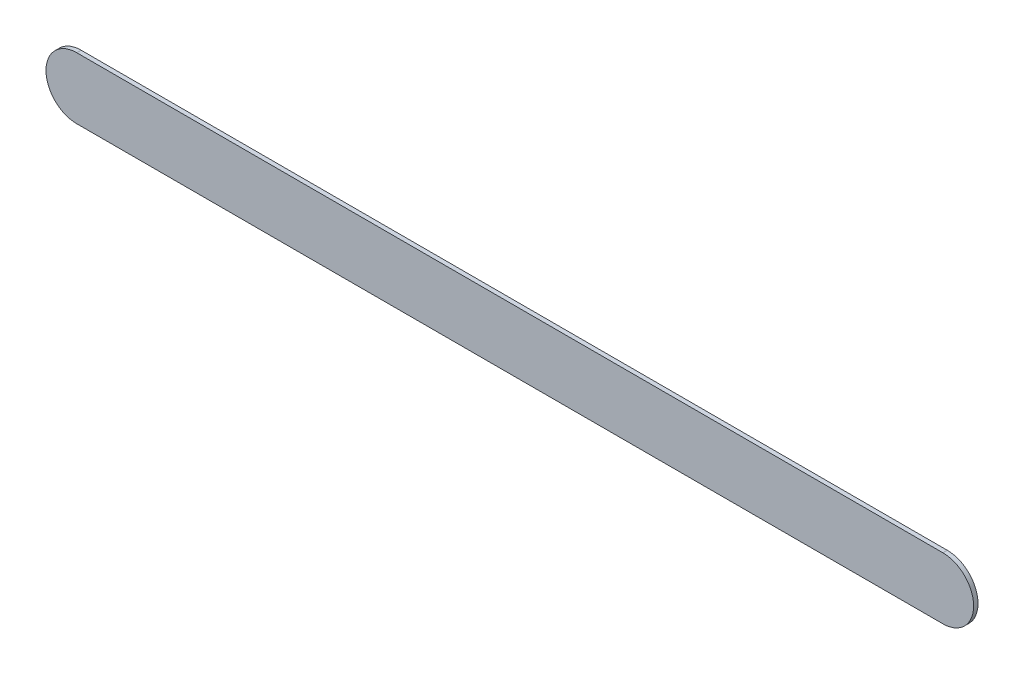
ISO-10303-21;
HEADER;
FILE_DESCRIPTION(('STEP AP214'),'2;1');
FILE_NAME('part.step','',(''),(''),'','','');
FILE_SCHEMA(('AUTOMOTIVE_DESIGN { 1 0 10303 214 1 1 1 1 }'));
ENDSEC;
DATA;
#1=APPLICATION_CONTEXT('core data for automotive mechanical design processes');
#2=APPLICATION_PROTOCOL_DEFINITION('international standard','automotive_design',2000,#1);
#3=PRODUCT_CONTEXT('',#1,'mechanical');
#4=PRODUCT('Part','Part','',(#3));
#5=PRODUCT_RELATED_PRODUCT_CATEGORY('part','',(#4));
#6=PRODUCT_DEFINITION_FORMATION('','',#4);
#7=PRODUCT_DEFINITION_CONTEXT('part definition',#1,'design');
#8=PRODUCT_DEFINITION('design','',#6,#7);
#9=PRODUCT_DEFINITION_SHAPE('','',#8);
#10=(LENGTH_UNIT() NAMED_UNIT(*) SI_UNIT(.MILLI.,.METRE.));
#11=(NAMED_UNIT(*) PLANE_ANGLE_UNIT() SI_UNIT($,.RADIAN.));
#12=(NAMED_UNIT(*) SI_UNIT($,.STERADIAN.) SOLID_ANGLE_UNIT());
#13=UNCERTAINTY_MEASURE_WITH_UNIT(LENGTH_MEASURE(1.E-05),#10,'distance_accuracy_value','');
#14=(GEOMETRIC_REPRESENTATION_CONTEXT(3) GLOBAL_UNCERTAINTY_ASSIGNED_CONTEXT((#13)) GLOBAL_UNIT_ASSIGNED_CONTEXT((#10,
#11,#12)) REPRESENTATION_CONTEXT('',''));
#15=CARTESIAN_POINT('',(0.,0.,0.));
#16=DIRECTION('',(0.,0.,1.));
#17=DIRECTION('',(1.,0.,0.));
#18=AXIS2_PLACEMENT_3D('',#15,#16,#17);
#19=CARTESIAN_POINT('',(39.3999974,105.74999932,0.));
#20=DIRECTION('',(0.,1.,0.));
#21=DIRECTION('',(1.,0.,0.));
#22=AXIS2_PLACEMENT_3D('',#19,#20,#21);
#23=PLANE('',#22);
#24=DIRECTION('',(1.,0.,0.));
#25=VECTOR('',#24,1.);
#26=CARTESIAN_POINT('',(39.3999974,105.74999932,0.03556));
#27=LINE('',#26,#25);
#28=CARTESIAN_POINT('',(39.3999974,105.74999932,0.03556));
#29=VERTEX_POINT('',#28);
#30=CARTESIAN_POINT('',(46.43901558,105.74999932,0.03556));
#31=VERTEX_POINT('',#30);
#32=EDGE_CURVE('E11',#29,#31,#27,.T.);
#33=ORIENTED_EDGE('',*,*,#32,.F.);
#34=DIRECTION('',(0.,0.,1.));
#35=VECTOR('',#34,1.);
#36=CARTESIAN_POINT('',(39.3999974,105.74999932,0.));
#37=LINE('',#36,#35);
#38=CARTESIAN_POINT('',(39.3999974,105.74999932,0.));
#39=VERTEX_POINT('',#38);
#40=EDGE_CURVE('E24',#39,#29,#37,.T.);
#41=ORIENTED_EDGE('',*,*,#40,.F.);
#42=DIRECTION('',(1.,0.,0.));
#43=VECTOR('',#42,1.);
#44=CARTESIAN_POINT('',(39.3999974,105.74999932,0.));
#45=LINE('',#44,#43);
#46=CARTESIAN_POINT('',(46.43901558,105.74999932,0.));
#47=VERTEX_POINT('',#46);
#48=EDGE_CURVE('E75',#39,#47,#45,.T.);
#49=ORIENTED_EDGE('',*,*,#48,.T.);
#50=DIRECTION('',(0.,0.,1.));
#51=VECTOR('',#50,1.);
#52=CARTESIAN_POINT('',(46.43901558,105.74999932,0.));
#53=LINE('',#52,#51);
#54=EDGE_CURVE('E37',#47,#31,#53,.T.);
#55=ORIENTED_EDGE('',*,*,#54,.T.);
#56=EDGE_LOOP('',(#33,#41,#49,#55));
#57=FACE_BOUND('',#56,.T.);
#58=ADVANCED_FACE('F17',(#57),#23,.F.);
#59=CARTESIAN_POINT('',(46.43901558,105.99999882,0.));
#60=DIRECTION('',(0.,0.,-1.));
#61=DIRECTION('',(0.,-1.,0.));
#62=AXIS2_PLACEMENT_3D('',#59,#60,#61);
#63=CYLINDRICAL_SURFACE('',#62,0.249999499999999);
#64=CARTESIAN_POINT('',(46.43901558,105.99999882,0.03556));
#65=DIRECTION('',(0.,0.,1.));
#66=DIRECTION('',(0.,-1.,0.));
#67=AXIS2_PLACEMENT_3D('',#64,#65,#66);
#68=CIRCLE('',#67,0.249999499999999);
#69=CARTESIAN_POINT('',(46.43901558,106.24999832,0.03556));
#70=VERTEX_POINT('',#69);
#71=EDGE_CURVE('E83',#31,#70,#68,.T.);
#72=ORIENTED_EDGE('',*,*,#71,.F.);
#73=ORIENTED_EDGE('',*,*,#54,.F.);
#74=CARTESIAN_POINT('',(46.43901558,105.99999882,0.));
#75=DIRECTION('',(0.,0.,1.));
#76=DIRECTION('',(0.,-1.,0.));
#77=AXIS2_PLACEMENT_3D('',#74,#75,#76);
#78=CIRCLE('',#77,0.249999499999999);
#79=CARTESIAN_POINT('',(46.43901558,106.24999832,0.));
#80=VERTEX_POINT('',#79);
#81=EDGE_CURVE('E81',#47,#80,#78,.T.);
#82=ORIENTED_EDGE('',*,*,#81,.T.);
#83=DIRECTION('',(0.,0.,1.));
#84=VECTOR('',#83,1.);
#85=CARTESIAN_POINT('',(46.43901558,106.24999832,0.));
#86=LINE('',#85,#84);
#87=EDGE_CURVE('E67',#80,#70,#86,.T.);
#88=ORIENTED_EDGE('',*,*,#87,.T.);
#89=EDGE_LOOP('',(#72,#73,#82,#88));
#90=FACE_BOUND('',#89,.T.);
#91=ADVANCED_FACE('F89',(#90),#63,.T.);
#92=CARTESIAN_POINT('',(46.43901558,106.24999832,0.));
#93=DIRECTION('',(0.,-1.,0.));
#94=DIRECTION('',(-1.,0.,0.));
#95=AXIS2_PLACEMENT_3D('',#92,#93,#94);
#96=PLANE('',#95);
#97=DIRECTION('',(-1.,0.,0.));
#98=VECTOR('',#97,1.);
#99=CARTESIAN_POINT('',(46.43901558,106.24999832,0.03556));
#100=LINE('',#99,#98);
#101=CARTESIAN_POINT('',(39.3999974,106.24999832,0.03556));
#102=VERTEX_POINT('',#101);
#103=EDGE_CURVE('E71',#70,#102,#100,.T.);
#104=ORIENTED_EDGE('',*,*,#103,.F.);
#105=ORIENTED_EDGE('',*,*,#87,.F.);
#106=DIRECTION('',(-1.,0.,0.));
#107=VECTOR('',#106,1.);
#108=CARTESIAN_POINT('',(46.43901558,106.24999832,0.));
#109=LINE('',#108,#107);
#110=CARTESIAN_POINT('',(39.3999974,106.24999832,0.));
#111=VERTEX_POINT('',#110);
#112=EDGE_CURVE('E63',#80,#111,#109,.T.);
#113=ORIENTED_EDGE('',*,*,#112,.T.);
#114=DIRECTION('',(0.,0.,1.));
#115=VECTOR('',#114,1.);
#116=CARTESIAN_POINT('',(39.3999974,106.24999832,0.));
#117=LINE('',#116,#115);
#118=EDGE_CURVE('E53',#111,#102,#117,.T.);
#119=ORIENTED_EDGE('',*,*,#118,.T.);
#120=EDGE_LOOP('',(#104,#105,#113,#119));
#121=FACE_BOUND('',#120,.T.);
#122=ADVANCED_FACE('F66',(#121),#96,.F.);
#123=CARTESIAN_POINT('',(39.3999974,105.99999882,0.));
#124=DIRECTION('',(0.,0.,-1.));
#125=DIRECTION('',(0.,1.,0.));
#126=AXIS2_PLACEMENT_3D('',#123,#124,#125);
#127=CYLINDRICAL_SURFACE('',#126,0.249999500000001);
#128=CARTESIAN_POINT('',(39.3999974,105.99999882,0.03556));
#129=DIRECTION('',(0.,0.,1.));
#130=DIRECTION('',(0.,1.,0.));
#131=AXIS2_PLACEMENT_3D('',#128,#129,#130);
#132=CIRCLE('',#131,0.249999500000001);
#133=EDGE_CURVE('E59',#102,#29,#132,.T.);
#134=ORIENTED_EDGE('',*,*,#133,.F.);
#135=ORIENTED_EDGE('',*,*,#118,.F.);
#136=CARTESIAN_POINT('',(39.3999974,105.99999882,0.));
#137=DIRECTION('',(0.,0.,1.));
#138=DIRECTION('',(0.,1.,0.));
#139=AXIS2_PLACEMENT_3D('',#136,#137,#138);
#140=CIRCLE('',#139,0.249999500000001);
#141=EDGE_CURVE('E57',#111,#39,#140,.T.);
#142=ORIENTED_EDGE('',*,*,#141,.T.);
#143=ORIENTED_EDGE('',*,*,#40,.T.);
#144=EDGE_LOOP('',(#134,#135,#142,#143));
#145=FACE_BOUND('',#144,.T.);
#146=ADVANCED_FACE('F55',(#145),#127,.T.);
#147=CARTESIAN_POINT('',(39.3999974,105.74999932,0.));
#148=DIRECTION('',(0.,0.,-1.));
#149=DIRECTION('',(-1.,0.,0.));
#150=AXIS2_PLACEMENT_3D('',#147,#148,#149);
#151=PLANE('',#150);
#152=ORIENTED_EDGE('',*,*,#141,.F.);
#153=ORIENTED_EDGE('',*,*,#112,.F.);
#154=ORIENTED_EDGE('',*,*,#81,.F.);
#155=ORIENTED_EDGE('',*,*,#48,.F.);
#156=EDGE_LOOP('',(#152,#153,#154,#155));
#157=FACE_BOUND('',#156,.T.);
#158=ADVANCED_FACE('F74',(#157),#151,.T.);
#159=CARTESIAN_POINT('',(39.3999974,105.74999932,0.03556));
#160=DIRECTION('',(0.,0.,-1.));
#161=DIRECTION('',(-1.,0.,0.));
#162=AXIS2_PLACEMENT_3D('',#159,#160,#161);
#163=PLANE('',#162);
#164=ORIENTED_EDGE('',*,*,#32,.T.);
#165=ORIENTED_EDGE('',*,*,#71,.T.);
#166=ORIENTED_EDGE('',*,*,#103,.T.);
#167=ORIENTED_EDGE('',*,*,#133,.T.);
#168=EDGE_LOOP('',(#164,#165,#166,#167));
#169=FACE_BOUND('',#168,.T.);
#170=ADVANCED_FACE('F91',(#169),#163,.F.);
#171=CLOSED_SHELL('',(#58,#91,#122,#146,#158,#170));
#172=MANIFOLD_SOLID_BREP('B1',#171);
#173=ADVANCED_BREP_SHAPE_REPRESENTATION('',(#18,#172),#14);
#174=SHAPE_DEFINITION_REPRESENTATION(#9,#173);
ENDSEC;
END-ISO-10303-21;
